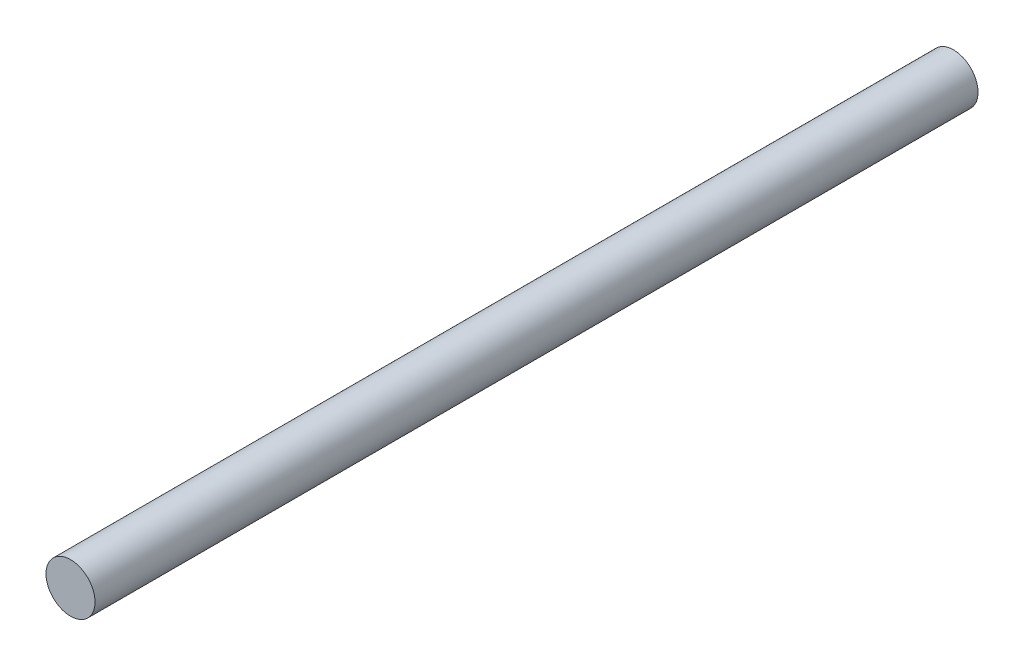
ISO-10303-21;
HEADER;
FILE_DESCRIPTION(('STEP AP214'),'2;1');
FILE_NAME('part.step','',(''),(''),'','','');
FILE_SCHEMA(('AUTOMOTIVE_DESIGN { 1 0 10303 214 1 1 1 1 }'));
ENDSEC;
DATA;
#1=APPLICATION_CONTEXT('core data for automotive mechanical design processes');
#2=APPLICATION_PROTOCOL_DEFINITION('international standard','automotive_design',2000,#1);
#3=PRODUCT_CONTEXT('',#1,'mechanical');
#4=PRODUCT('Part','Part','',(#3));
#5=PRODUCT_RELATED_PRODUCT_CATEGORY('part','',(#4));
#6=PRODUCT_DEFINITION_FORMATION('','',#4);
#7=PRODUCT_DEFINITION_CONTEXT('part definition',#1,'design');
#8=PRODUCT_DEFINITION('design','',#6,#7);
#9=PRODUCT_DEFINITION_SHAPE('','',#8);
#10=(LENGTH_UNIT() NAMED_UNIT(*) SI_UNIT(.MILLI.,.METRE.));
#11=(NAMED_UNIT(*) PLANE_ANGLE_UNIT() SI_UNIT($,.RADIAN.));
#12=(NAMED_UNIT(*) SI_UNIT($,.STERADIAN.) SOLID_ANGLE_UNIT());
#13=UNCERTAINTY_MEASURE_WITH_UNIT(LENGTH_MEASURE(1.E-05),#10,'distance_accuracy_value','');
#14=(GEOMETRIC_REPRESENTATION_CONTEXT(3) GLOBAL_UNCERTAINTY_ASSIGNED_CONTEXT((#13)) GLOBAL_UNIT_ASSIGNED_CONTEXT((#10,
#11,#12)) REPRESENTATION_CONTEXT('',''));
#15=CARTESIAN_POINT('',(0.,0.,0.));
#16=DIRECTION('',(0.,0.,1.));
#17=DIRECTION('',(1.,0.,0.));
#18=AXIS2_PLACEMENT_3D('',#15,#16,#17);
#19=CARTESIAN_POINT('',(0.,0.,90.));
#20=DIRECTION('',(0.,0.,-1.));
#21=DIRECTION('',(-1.,0.,0.));
#22=AXIS2_PLACEMENT_3D('',#19,#20,#21);
#23=CYLINDRICAL_SURFACE('',#22,2.5);
#24=CARTESIAN_POINT('',(0.,0.,90.));
#25=DIRECTION('',(0.,0.,1.));
#26=DIRECTION('',(1.,0.,0.));
#27=AXIS2_PLACEMENT_3D('',#24,#25,#26);
#28=CIRCLE('',#27,2.5);
#29=CARTESIAN_POINT('',(-2.5,0.,90.));
#30=VERTEX_POINT('',#29);
#31=EDGE_CURVE('E10',#30,#30,#28,.T.);
#32=CARTESIAN_POINT('',(0.,0.,0.));
#33=DIRECTION('',(0.,0.,1.));
#34=DIRECTION('',(1.,0.,0.));
#35=AXIS2_PLACEMENT_3D('',#32,#33,#34);
#36=CIRCLE('',#35,2.5);
#37=CARTESIAN_POINT('',(-2.5,0.,0.));
#38=VERTEX_POINT('',#37);
#39=EDGE_CURVE('E34',#38,#38,#36,.T.);
#40=CARTESIAN_POINT('',(-2.5,0.,90.));
#41=CARTESIAN_POINT('',(-2.5,0.,89.0625));
#42=CARTESIAN_POINT('',(-2.5,0.,88.125));
#43=CARTESIAN_POINT('',(-2.5,0.,86.25));
#44=CARTESIAN_POINT('',(-2.5,0.,85.3125));
#45=CARTESIAN_POINT('',(-2.5,0.,83.4375));
#46=CARTESIAN_POINT('',(-2.5,0.,82.5));
#47=CARTESIAN_POINT('',(-2.5,0.,80.625));
#48=CARTESIAN_POINT('',(-2.5,0.,79.6875));
#49=CARTESIAN_POINT('',(-2.5,0.,77.8125));
#50=CARTESIAN_POINT('',(-2.5,0.,76.875));
#51=CARTESIAN_POINT('',(-2.5,0.,75.));
#52=CARTESIAN_POINT('',(-2.5,0.,74.0625));
#53=CARTESIAN_POINT('',(-2.5,0.,72.1875));
#54=CARTESIAN_POINT('',(-2.5,0.,71.25));
#55=CARTESIAN_POINT('',(-2.5,0.,69.375));
#56=CARTESIAN_POINT('',(-2.5,0.,68.4375));
#57=CARTESIAN_POINT('',(-2.5,0.,66.5625));
#58=CARTESIAN_POINT('',(-2.5,0.,65.625));
#59=CARTESIAN_POINT('',(-2.5,0.,63.75));
#60=CARTESIAN_POINT('',(-2.5,0.,62.8125));
#61=CARTESIAN_POINT('',(-2.5,0.,60.9375));
#62=CARTESIAN_POINT('',(-2.5,0.,60.));
#63=CARTESIAN_POINT('',(-2.5,0.,58.125));
#64=CARTESIAN_POINT('',(-2.5,0.,57.1875));
#65=CARTESIAN_POINT('',(-2.5,0.,55.3125));
#66=CARTESIAN_POINT('',(-2.5,0.,54.375));
#67=CARTESIAN_POINT('',(-2.5,0.,52.5));
#68=CARTESIAN_POINT('',(-2.5,0.,51.5625));
#69=CARTESIAN_POINT('',(-2.5,0.,49.6875));
#70=CARTESIAN_POINT('',(-2.5,0.,48.75));
#71=CARTESIAN_POINT('',(-2.5,0.,46.875));
#72=CARTESIAN_POINT('',(-2.5,0.,45.9375));
#73=CARTESIAN_POINT('',(-2.5,0.,44.0625));
#74=CARTESIAN_POINT('',(-2.5,0.,43.125));
#75=CARTESIAN_POINT('',(-2.5,0.,41.25));
#76=CARTESIAN_POINT('',(-2.5,0.,40.3125));
#77=CARTESIAN_POINT('',(-2.5,0.,38.4375));
#78=CARTESIAN_POINT('',(-2.5,0.,37.5));
#79=CARTESIAN_POINT('',(-2.5,0.,35.625));
#80=CARTESIAN_POINT('',(-2.5,0.,34.6875));
#81=CARTESIAN_POINT('',(-2.5,0.,32.8125));
#82=CARTESIAN_POINT('',(-2.5,0.,31.875));
#83=CARTESIAN_POINT('',(-2.5,0.,30.));
#84=CARTESIAN_POINT('',(-2.5,0.,29.0625));
#85=CARTESIAN_POINT('',(-2.5,0.,27.1875));
#86=CARTESIAN_POINT('',(-2.5,0.,26.25));
#87=CARTESIAN_POINT('',(-2.5,0.,24.375));
#88=CARTESIAN_POINT('',(-2.5,0.,23.4375));
#89=CARTESIAN_POINT('',(-2.5,0.,21.5625));
#90=CARTESIAN_POINT('',(-2.5,0.,20.625));
#91=CARTESIAN_POINT('',(-2.5,0.,18.75));
#92=CARTESIAN_POINT('',(-2.5,0.,17.8125));
#93=CARTESIAN_POINT('',(-2.5,0.,15.9375));
#94=CARTESIAN_POINT('',(-2.5,0.,15.));
#95=CARTESIAN_POINT('',(-2.5,0.,13.125));
#96=CARTESIAN_POINT('',(-2.5,0.,12.1875));
#97=CARTESIAN_POINT('',(-2.5,0.,10.3125));
#98=CARTESIAN_POINT('',(-2.5,0.,9.37499999999999));
#99=CARTESIAN_POINT('',(-2.5,0.,7.49999999999999));
#100=CARTESIAN_POINT('',(-2.5,0.,6.56249999999999));
#101=CARTESIAN_POINT('',(-2.5,0.,4.68749999999999));
#102=CARTESIAN_POINT('',(-2.5,0.,3.74999999999998));
#103=CARTESIAN_POINT('',(-2.5,0.,1.87499999999998));
#104=CARTESIAN_POINT('',(-2.5,0.,0.937499999999986));
#105=CARTESIAN_POINT('',(-2.5,0.,0.));
#106=B_SPLINE_CURVE_WITH_KNOTS('',3,(#40,#41,#42,#43,#44,#45,#46,#47,#48,#49,#50,#51,#52,#53,
#54,#55,#56,#57,#58,#59,#60,#61,#62,#63,#64,#65,#66,#67,#68,#69,#70,#71,#72,#73,#74,#75,#76,#77,
#78,#79,#80,#81,#82,#83,#84,#85,#86,#87,#88,#89,#90,#91,#92,#93,#94,#95,#96,#97,#98,#99,#100,
#101,#102,#103,#104,#105),.UNSPECIFIED.,.F.,.F.,(4,2,2,2,2,2,2,2,2,2,2,2,2,2,2,2,2,2,2,2,2,2,2,
2,2,2,2,2,2,2,2,2,4),(0.,2.81250000000001,5.62500000000001,8.43750000000001,11.25,14.0625,
16.875,19.6875,22.5,25.3125,28.125,30.9375,33.75,36.5625,39.375,42.1875,45.,47.8125,50.625,
53.4375,56.25,59.0625,61.875,64.6875,67.5,70.3125,73.125,75.9375,78.75,81.5625,84.375,87.1875,
90.),.UNSPECIFIED.);
#107=EDGE_CURVE('BSEAM31',#30,#38,#106,.T.);
#108=ORIENTED_EDGE('',*,*,#31,.F.);
#109=ORIENTED_EDGE('',*,*,#39,.T.);
#110=ORIENTED_EDGE('',*,*,#107,.T.);
#111=ORIENTED_EDGE('',*,*,#107,.F.);
#112=EDGE_LOOP('',(#108,#110,#109,#111));
#113=FACE_BOUND('',#112,.T.);
#114=ADVANCED_FACE('F31',(#113),#23,.T.);
#115=CARTESIAN_POINT('',(0.,0.,90.));
#116=DIRECTION('',(0.,0.,1.));
#117=DIRECTION('',(1.,0.,0.));
#118=AXIS2_PLACEMENT_3D('',#115,#116,#117);
#119=PLANE('',#118);
#120=ORIENTED_EDGE('',*,*,#31,.T.);
#121=EDGE_LOOP('',(#120));
#122=FACE_BOUND('',#121,.T.);
#123=ADVANCED_FACE('F46',(#122),#119,.T.);
#124=CARTESIAN_POINT('',(0.,0.,0.));
#125=DIRECTION('',(0.,0.,1.));
#126=DIRECTION('',(1.,0.,0.));
#127=AXIS2_PLACEMENT_3D('',#124,#125,#126);
#128=PLANE('',#127);
#129=ORIENTED_EDGE('',*,*,#39,.F.);
#130=EDGE_LOOP('',(#129));
#131=FACE_BOUND('',#130,.T.);
#132=ADVANCED_FACE('F44',(#131),#128,.F.);
#133=CLOSED_SHELL('',(#114,#123,#132));
#134=MANIFOLD_SOLID_BREP('B2',#133);
#135=ADVANCED_BREP_SHAPE_REPRESENTATION('',(#18,#134),#14);
#136=SHAPE_DEFINITION_REPRESENTATION(#9,#135);
ENDSEC;
END-ISO-10303-21;
